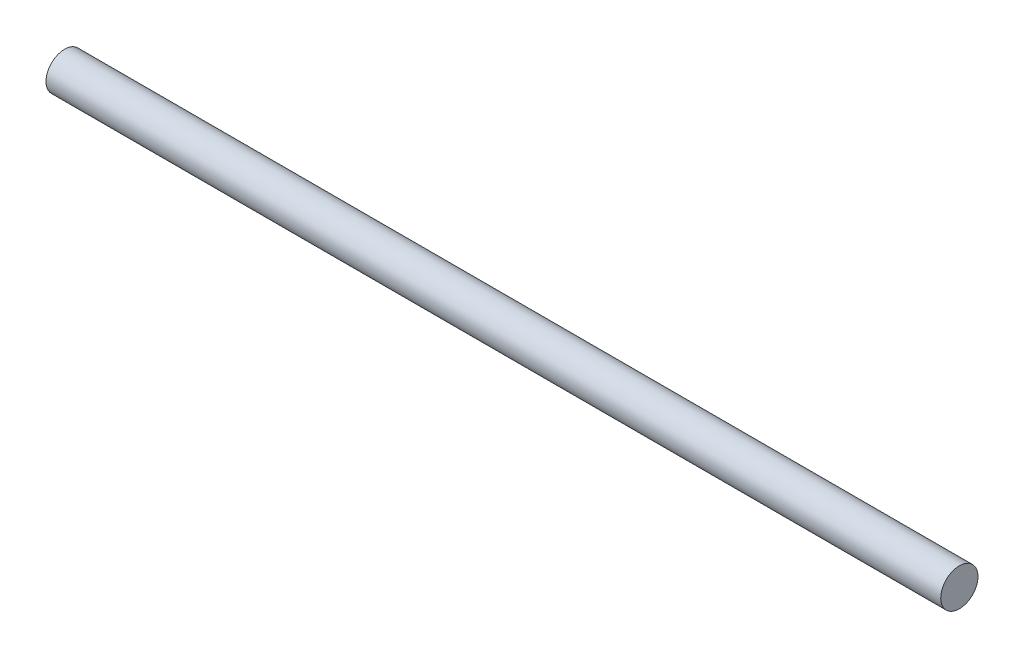
ISO-10303-21;
HEADER;
FILE_DESCRIPTION(('STEP AP214'),'2;1');
FILE_NAME('part.step','',(''),(''),'','','');
FILE_SCHEMA(('AUTOMOTIVE_DESIGN { 1 0 10303 214 1 1 1 1 }'));
ENDSEC;
DATA;
#1=APPLICATION_CONTEXT('core data for automotive mechanical design processes');
#2=APPLICATION_PROTOCOL_DEFINITION('international standard','automotive_design',2000,#1);
#3=PRODUCT_CONTEXT('',#1,'mechanical');
#4=PRODUCT('Part','Part','',(#3));
#5=PRODUCT_RELATED_PRODUCT_CATEGORY('part','',(#4));
#6=PRODUCT_DEFINITION_FORMATION('','',#4);
#7=PRODUCT_DEFINITION_CONTEXT('part definition',#1,'design');
#8=PRODUCT_DEFINITION('design','',#6,#7);
#9=PRODUCT_DEFINITION_SHAPE('','',#8);
#10=(LENGTH_UNIT() NAMED_UNIT(*) SI_UNIT(.MILLI.,.METRE.));
#11=(NAMED_UNIT(*) PLANE_ANGLE_UNIT() SI_UNIT($,.RADIAN.));
#12=(NAMED_UNIT(*) SI_UNIT($,.STERADIAN.) SOLID_ANGLE_UNIT());
#13=UNCERTAINTY_MEASURE_WITH_UNIT(LENGTH_MEASURE(1.E-05),#10,'distance_accuracy_value','');
#14=(GEOMETRIC_REPRESENTATION_CONTEXT(3) GLOBAL_UNCERTAINTY_ASSIGNED_CONTEXT((#13)) GLOBAL_UNIT_ASSIGNED_CONTEXT((#10,
#11,#12)) REPRESENTATION_CONTEXT('',''));
#15=CARTESIAN_POINT('',(0.,0.,0.));
#16=DIRECTION('',(0.,0.,1.));
#17=DIRECTION('',(1.,0.,0.));
#18=AXIS2_PLACEMENT_3D('',#15,#16,#17);
#19=CARTESIAN_POINT('',(0.,0.,0.));
#20=DIRECTION('',(-1.,0.,0.));
#21=DIRECTION('',(0.,-1.,0.));
#22=AXIS2_PLACEMENT_3D('',#19,#20,#21);
#23=PLANE('',#22);
#24=CARTESIAN_POINT('',(0.,5.,0.));
#25=DIRECTION('',(1.,0.,0.));
#26=DIRECTION('',(0.,1.,0.));
#27=AXIS2_PLACEMENT_3D('',#24,#25,#26);
#28=CIRCLE('',#27,5.);
#29=CARTESIAN_POINT('',(0.,10.,0.));
#30=VERTEX_POINT('',#29);
#31=EDGE_CURVE('E37',#30,#30,#28,.T.);
#32=ORIENTED_EDGE('',*,*,#31,.T.);
#33=EDGE_LOOP('',(#32));
#34=FACE_BOUND('',#33,.T.);
#35=ADVANCED_FACE('F31',(#34),#23,.F.);
#36=CARTESIAN_POINT('',(-240.,0.,0.));
#37=DIRECTION('',(1.,0.,0.));
#38=DIRECTION('',(0.,1.,0.));
#39=AXIS2_PLACEMENT_3D('',#36,#37,#38);
#40=PLANE('',#39);
#41=CARTESIAN_POINT('',(-240.,5.,0.));
#42=DIRECTION('',(1.,0.,0.));
#43=DIRECTION('',(0.,1.,0.));
#44=AXIS2_PLACEMENT_3D('',#41,#42,#43);
#45=CIRCLE('',#44,5.);
#46=CARTESIAN_POINT('',(-240.,10.,0.));
#47=VERTEX_POINT('',#46);
#48=EDGE_CURVE('E10',#47,#47,#45,.T.);
#49=ORIENTED_EDGE('',*,*,#48,.F.);
#50=EDGE_LOOP('',(#49));
#51=FACE_BOUND('',#50,.T.);
#52=ADVANCED_FACE('F46',(#51),#40,.F.);
#53=CARTESIAN_POINT('',(0.,5.,0.));
#54=DIRECTION('',(1.,0.,0.));
#55=DIRECTION('',(0.,1.,0.));
#56=AXIS2_PLACEMENT_3D('',#53,#54,#55);
#57=CYLINDRICAL_SURFACE('',#56,5.);
#58=ORIENTED_EDGE('',*,*,#31,.F.);
#59=EDGE_LOOP('',(#58));
#60=FACE_BOUND('',#59,.T.);
#61=ORIENTED_EDGE('',*,*,#48,.T.);
#62=EDGE_LOOP('',(#61));
#63=FACE_BOUND('',#62,.T.);
#64=ADVANCED_FACE('F44',(#60,#63),#57,.T.);
#65=CLOSED_SHELL('',(#35,#52,#64));
#66=MANIFOLD_SOLID_BREP('B2',#65);
#67=ADVANCED_BREP_SHAPE_REPRESENTATION('',(#18,#66),#14);
#68=SHAPE_DEFINITION_REPRESENTATION(#9,#67);
ENDSEC;
END-ISO-10303-21;
